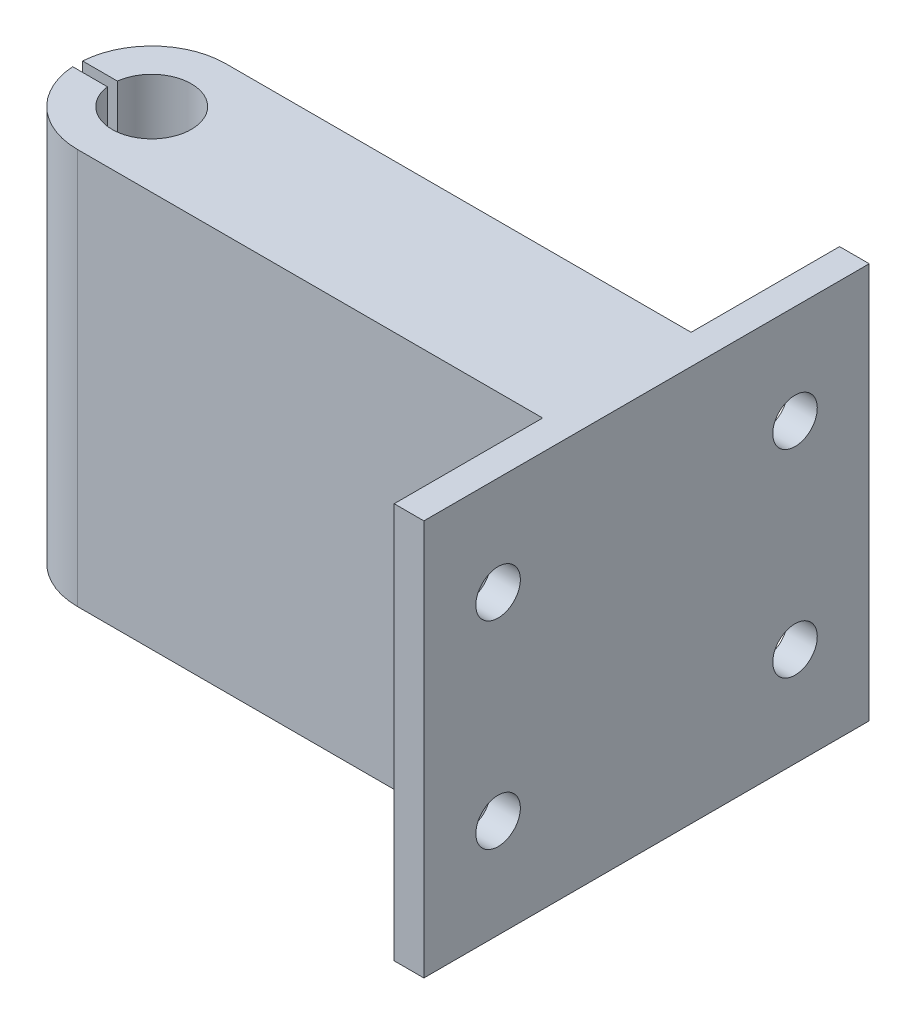
ISO-10303-21;
HEADER;
FILE_DESCRIPTION(('STEP AP214'),'2;1');
FILE_NAME('part.step','',(''),(''),'','','');
FILE_SCHEMA(('AUTOMOTIVE_DESIGN { 1 0 10303 214 1 1 1 1 }'));
ENDSEC;
DATA;
#1=APPLICATION_CONTEXT('core data for automotive mechanical design processes');
#2=APPLICATION_PROTOCOL_DEFINITION('international standard','automotive_design',2000,#1);
#3=PRODUCT_CONTEXT('',#1,'mechanical');
#4=PRODUCT('Part','Part','',(#3));
#5=PRODUCT_RELATED_PRODUCT_CATEGORY('part','',(#4));
#6=PRODUCT_DEFINITION_FORMATION('','',#4);
#7=PRODUCT_DEFINITION_CONTEXT('part definition',#1,'design');
#8=PRODUCT_DEFINITION('design','',#6,#7);
#9=PRODUCT_DEFINITION_SHAPE('','',#8);
#10=(LENGTH_UNIT() NAMED_UNIT(*) SI_UNIT(.MILLI.,.METRE.));
#11=(NAMED_UNIT(*) PLANE_ANGLE_UNIT() SI_UNIT($,.RADIAN.));
#12=(NAMED_UNIT(*) SI_UNIT($,.STERADIAN.) SOLID_ANGLE_UNIT());
#13=UNCERTAINTY_MEASURE_WITH_UNIT(LENGTH_MEASURE(1.E-05),#10,'distance_accuracy_value','');
#14=(GEOMETRIC_REPRESENTATION_CONTEXT(3) GLOBAL_UNCERTAINTY_ASSIGNED_CONTEXT((#13)) GLOBAL_UNIT_ASSIGNED_CONTEXT((#10,
#11,#12)) REPRESENTATION_CONTEXT('',''));
#15=CARTESIAN_POINT('',(0.,0.,0.));
#16=DIRECTION('',(0.,0.,1.));
#17=DIRECTION('',(1.,0.,0.));
#18=AXIS2_PLACEMENT_3D('',#15,#16,#17);
#19=CARTESIAN_POINT('',(0.,0.,0.));
#20=DIRECTION('',(0.,0.,1.));
#21=DIRECTION('',(1.,0.,0.));
#22=AXIS2_PLACEMENT_3D('',#19,#20,#21);
#23=PLANE('',#22);
#24=DIRECTION('',(0.,1.,0.));
#25=VECTOR('',#24,1.);
#26=CARTESIAN_POINT('',(-3.,40.,0.));
#27=LINE('',#26,#25);
#28=CARTESIAN_POINT('',(-3.00000000000001,0.,0.));
#29=VERTEX_POINT('',#28);
#30=CARTESIAN_POINT('',(-3.,40.,0.));
#31=VERTEX_POINT('',#30);
#32=EDGE_CURVE('E238',#29,#31,#27,.T.);
#33=ORIENTED_EDGE('',*,*,#32,.F.);
#34=DIRECTION('',(1.,0.,0.));
#35=VECTOR('',#34,1.);
#36=CARTESIAN_POINT('',(-57.5,0.,0.));
#37=LINE('',#36,#35);
#38=CARTESIAN_POINT('',(-50.,0.,0.));
#39=VERTEX_POINT('',#38);
#40=EDGE_CURVE('E186',#39,#29,#37,.T.);
#41=ORIENTED_EDGE('',*,*,#40,.F.);
#42=DIRECTION('',(0.,-1.,0.));
#43=VECTOR('',#42,1.);
#44=CARTESIAN_POINT('',(-50.,0.,0.));
#45=LINE('',#44,#43);
#46=CARTESIAN_POINT('',(-50.,40.,0.));
#47=VERTEX_POINT('',#46);
#48=EDGE_CURVE('E201',#39,#47,#45,.F.);
#49=ORIENTED_EDGE('',*,*,#48,.T.);
#50=DIRECTION('',(-1.,0.,0.));
#51=VECTOR('',#50,1.);
#52=CARTESIAN_POINT('',(19.,40.,0.));
#53=LINE('',#52,#51);
#54=EDGE_CURVE('E190',#31,#47,#53,.T.);
#55=ORIENTED_EDGE('',*,*,#54,.F.);
#56=EDGE_LOOP('',(#33,#41,#49,#55));
#57=FACE_BOUND('',#56,.T.);
#58=ADVANCED_FACE('F33',(#57),#23,.F.);
#59=CARTESIAN_POINT('',(0.,0.,15.));
#60=DIRECTION('',(0.,0.,1.));
#61=DIRECTION('',(1.,0.,0.));
#62=AXIS2_PLACEMENT_3D('',#59,#60,#61);
#63=PLANE('',#62);
#64=DIRECTION('',(1.,0.,0.));
#65=VECTOR('',#64,1.);
#66=CARTESIAN_POINT('',(-57.5,0.,15.));
#67=LINE('',#66,#65);
#68=CARTESIAN_POINT('',(-50.,0.,15.));
#69=VERTEX_POINT('',#68);
#70=CARTESIAN_POINT('',(-3.,0.,15.));
#71=VERTEX_POINT('',#70);
#72=EDGE_CURVE('E57',#69,#71,#67,.T.);
#73=ORIENTED_EDGE('',*,*,#72,.T.);
#74=DIRECTION('',(0.,-1.,0.));
#75=VECTOR('',#74,1.);
#76=CARTESIAN_POINT('',(-3.,0.,15.));
#77=LINE('',#76,#75);
#78=CARTESIAN_POINT('',(-3.,40.,15.));
#79=VERTEX_POINT('',#78);
#80=EDGE_CURVE('E154',#79,#71,#77,.T.);
#81=ORIENTED_EDGE('',*,*,#80,.F.);
#82=DIRECTION('',(-1.,0.,0.));
#83=VECTOR('',#82,1.);
#84=CARTESIAN_POINT('',(19.,40.,15.));
#85=LINE('',#84,#83);
#86=CARTESIAN_POINT('',(-50.,40.,15.));
#87=VERTEX_POINT('',#86);
#88=EDGE_CURVE('E189',#79,#87,#85,.T.);
#89=ORIENTED_EDGE('',*,*,#88,.T.);
#90=DIRECTION('',(0.,-1.,0.));
#91=VECTOR('',#90,1.);
#92=CARTESIAN_POINT('',(-50.,0.,15.));
#93=LINE('',#92,#91);
#94=EDGE_CURVE('E42',#87,#69,#93,.T.);
#95=ORIENTED_EDGE('',*,*,#94,.T.);
#96=EDGE_LOOP('',(#73,#81,#89,#95));
#97=FACE_BOUND('',#96,.T.);
#98=ADVANCED_FACE('F216',(#97),#63,.T.);
#99=CARTESIAN_POINT('',(-57.5,0.,15.));
#100=DIRECTION('',(0.,1.,0.));
#101=DIRECTION('',(0.,0.,1.));
#102=AXIS2_PLACEMENT_3D('',#99,#100,#101);
#103=PLANE('',#102);
#104=CARTESIAN_POINT('',(-50.,0.,7.5));
#105=DIRECTION('',(0.,1.,0.));
#106=DIRECTION('',(0.,0.,1.));
#107=AXIS2_PLACEMENT_3D('',#104,#105,#106);
#108=CIRCLE('',#107,7.5);
#109=CARTESIAN_POINT('',(-57.5,0.,7.5));
#110=VERTEX_POINT('',#109);
#111=EDGE_CURVE('E197',#69,#110,#108,.F.);
#112=ORIENTED_EDGE('',*,*,#111,.T.);
#113=CARTESIAN_POINT('',(-50.,0.,7.5));
#114=DIRECTION('',(0.,1.,0.));
#115=DIRECTION('',(0.,0.,1.));
#116=AXIS2_PLACEMENT_3D('',#113,#114,#115);
#117=CIRCLE('',#116,7.5);
#118=EDGE_CURVE('E199',#110,#39,#117,.F.);
#119=ORIENTED_EDGE('',*,*,#118,.T.);
#120=ORIENTED_EDGE('',*,*,#40,.T.);
#121=DIRECTION('',(0.,0.,1.));
#122=VECTOR('',#121,1.);
#123=CARTESIAN_POINT('',(-3.00000000000001,0.,-15.));
#124=LINE('',#123,#122);
#125=CARTESIAN_POINT('',(-3.00000000000001,0.,-15.));
#126=VERTEX_POINT('',#125);
#127=EDGE_CURVE('E157',#126,#29,#124,.T.);
#128=ORIENTED_EDGE('',*,*,#127,.F.);
#129=DIRECTION('',(-1.,0.,0.));
#130=VECTOR('',#129,1.);
#131=CARTESIAN_POINT('',(-3.00000000000001,0.,-15.));
#132=LINE('',#131,#130);
#133=CARTESIAN_POINT('',(0.,0.,-15.));
#134=VERTEX_POINT('',#133);
#135=EDGE_CURVE('E242',#134,#126,#132,.T.);
#136=ORIENTED_EDGE('',*,*,#135,.F.);
#137=DIRECTION('',(0.,0.,-1.));
#138=VECTOR('',#137,1.);
#139=CARTESIAN_POINT('',(0.,0.,15.));
#140=LINE('',#139,#138);
#141=CARTESIAN_POINT('',(0.,0.,30.));
#142=VERTEX_POINT('',#141);
#143=EDGE_CURVE('E192',#142,#134,#140,.T.);
#144=ORIENTED_EDGE('',*,*,#143,.F.);
#145=DIRECTION('',(1.,0.,0.));
#146=VECTOR('',#145,1.);
#147=CARTESIAN_POINT('',(0.,0.,30.));
#148=LINE('',#147,#146);
#149=CARTESIAN_POINT('',(-3.,0.,30.));
#150=VERTEX_POINT('',#149);
#151=EDGE_CURVE('E136',#150,#142,#148,.T.);
#152=ORIENTED_EDGE('',*,*,#151,.F.);
#153=DIRECTION('',(0.,0.,-1.));
#154=VECTOR('',#153,1.);
#155=CARTESIAN_POINT('',(-3.,0.,30.));
#156=LINE('',#155,#154);
#157=EDGE_CURVE('E138',#150,#71,#156,.T.);
#158=ORIENTED_EDGE('',*,*,#157,.T.);
#159=ORIENTED_EDGE('',*,*,#72,.F.);
#160=EDGE_LOOP('',(#112,#119,#120,#128,#136,#144,#152,#158,#159));
#161=FACE_BOUND('',#160,.T.);
#162=ADVANCED_FACE('F221',(#161),#103,.F.);
#163=CARTESIAN_POINT('',(0.,0.,15.));
#164=DIRECTION('',(-1.,0.,0.));
#165=DIRECTION('',(0.,0.,1.));
#166=AXIS2_PLACEMENT_3D('',#163,#164,#165);
#167=PLANE('',#166);
#168=CARTESIAN_POINT('',(0.,10.,22.5));
#169=DIRECTION('',(-1.,0.,0.));
#170=DIRECTION('',(0.,0.,1.));
#171=AXIS2_PLACEMENT_3D('',#168,#169,#170);
#172=CIRCLE('',#171,2.25);
#173=CARTESIAN_POINT('',(0.,10.,24.75));
#174=VERTEX_POINT('',#173);
#175=EDGE_CURVE('E269',#174,#174,#172,.F.);
#176=ORIENTED_EDGE('',*,*,#175,.F.);
#177=EDGE_LOOP('',(#176));
#178=FACE_BOUND('',#177,.T.);
#179=CARTESIAN_POINT('',(0.,30.,22.5));
#180=DIRECTION('',(-1.,0.,0.));
#181=DIRECTION('',(0.,0.,1.));
#182=AXIS2_PLACEMENT_3D('',#179,#180,#181);
#183=CIRCLE('',#182,2.25);
#184=CARTESIAN_POINT('',(0.,30.,24.75));
#185=VERTEX_POINT('',#184);
#186=EDGE_CURVE('E263',#185,#185,#183,.F.);
#187=ORIENTED_EDGE('',*,*,#186,.F.);
#188=EDGE_LOOP('',(#187));
#189=FACE_BOUND('',#188,.T.);
#190=CARTESIAN_POINT('',(0.,10.,-7.5));
#191=DIRECTION('',(-1.,0.,0.));
#192=DIRECTION('',(0.,0.,1.));
#193=AXIS2_PLACEMENT_3D('',#190,#191,#192);
#194=CIRCLE('',#193,2.25);
#195=CARTESIAN_POINT('',(0.,10.,-5.24999999999999));
#196=VERTEX_POINT('',#195);
#197=EDGE_CURVE('E257',#196,#196,#194,.T.);
#198=ORIENTED_EDGE('',*,*,#197,.T.);
#199=EDGE_LOOP('',(#198));
#200=FACE_BOUND('',#199,.T.);
#201=CARTESIAN_POINT('',(0.,30.,-7.5));
#202=DIRECTION('',(-1.,0.,0.));
#203=DIRECTION('',(0.,0.,1.));
#204=AXIS2_PLACEMENT_3D('',#201,#202,#203);
#205=CIRCLE('',#204,2.25);
#206=CARTESIAN_POINT('',(0.,30.,-5.25));
#207=VERTEX_POINT('',#206);
#208=EDGE_CURVE('E240',#207,#207,#205,.T.);
#209=ORIENTED_EDGE('',*,*,#208,.T.);
#210=EDGE_LOOP('',(#209));
#211=FACE_BOUND('',#210,.T.);
#212=ORIENTED_EDGE('',*,*,#143,.T.);
#213=DIRECTION('',(0.,-1.,0.));
#214=VECTOR('',#213,1.);
#215=CARTESIAN_POINT('',(0.,0.,-15.));
#216=LINE('',#215,#214);
#217=CARTESIAN_POINT('',(0.,40.,-15.));
#218=VERTEX_POINT('',#217);
#219=EDGE_CURVE('E144',#218,#134,#216,.T.);
#220=ORIENTED_EDGE('',*,*,#219,.F.);
#221=DIRECTION('',(0.,0.,-1.));
#222=VECTOR('',#221,1.);
#223=CARTESIAN_POINT('',(0.,40.,15.));
#224=LINE('',#223,#222);
#225=CARTESIAN_POINT('',(0.,40.,30.));
#226=VERTEX_POINT('',#225);
#227=EDGE_CURVE('E141',#226,#218,#224,.T.);
#228=ORIENTED_EDGE('',*,*,#227,.F.);
#229=DIRECTION('',(0.,1.,0.));
#230=VECTOR('',#229,1.);
#231=CARTESIAN_POINT('',(0.,37.,30.));
#232=LINE('',#231,#230);
#233=EDGE_CURVE('E129',#142,#226,#232,.T.);
#234=ORIENTED_EDGE('',*,*,#233,.F.);
#235=EDGE_LOOP('',(#212,#220,#228,#234));
#236=FACE_BOUND('',#235,.T.);
#237=ADVANCED_FACE('F142',(#178,#189,#200,#211,#236),#167,.F.);
#238=CARTESIAN_POINT('',(19.,40.,15.));
#239=DIRECTION('',(0.,-1.,0.));
#240=DIRECTION('',(1.,0.,0.));
#241=AXIS2_PLACEMENT_3D('',#238,#239,#240);
#242=PLANE('',#241);
#243=DIRECTION('',(-1.,0.,0.));
#244=VECTOR('',#243,1.);
#245=CARTESIAN_POINT('',(-3.,40.,30.));
#246=LINE('',#245,#244);
#247=CARTESIAN_POINT('',(-3.,40.,30.));
#248=VERTEX_POINT('',#247);
#249=EDGE_CURVE('E133',#226,#248,#246,.T.);
#250=ORIENTED_EDGE('',*,*,#249,.F.);
#251=ORIENTED_EDGE('',*,*,#227,.T.);
#252=DIRECTION('',(1.,0.,0.));
#253=VECTOR('',#252,1.);
#254=CARTESIAN_POINT('',(19.,40.,-15.));
#255=LINE('',#254,#253);
#256=CARTESIAN_POINT('',(-3.,40.,-15.));
#257=VERTEX_POINT('',#256);
#258=EDGE_CURVE('E248',#257,#218,#255,.T.);
#259=ORIENTED_EDGE('',*,*,#258,.F.);
#260=DIRECTION('',(0.,0.,1.));
#261=VECTOR('',#260,1.);
#262=CARTESIAN_POINT('',(-3.,40.,-15.));
#263=LINE('',#262,#261);
#264=EDGE_CURVE('E49',#257,#31,#263,.T.);
#265=ORIENTED_EDGE('',*,*,#264,.T.);
#266=ORIENTED_EDGE('',*,*,#54,.T.);
#267=CARTESIAN_POINT('',(-50.,40.,7.5));
#268=DIRECTION('',(0.,-1.,0.));
#269=DIRECTION('',(1.,0.,0.));
#270=AXIS2_PLACEMENT_3D('',#267,#268,#269);
#271=CIRCLE('',#270,7.5);
#272=CARTESIAN_POINT('',(-57.4833147735479,40.,7.));
#273=VERTEX_POINT('',#272);
#274=EDGE_CURVE('E207',#47,#273,#271,.F.);
#275=ORIENTED_EDGE('',*,*,#274,.T.);
#276=DIRECTION('',(-1.,0.,0.));
#277=VECTOR('',#276,1.);
#278=CARTESIAN_POINT('',(-53.9686269665969,40.,7.));
#279=LINE('',#278,#277);
#280=CARTESIAN_POINT('',(-53.9686269665969,40.,7.));
#281=VERTEX_POINT('',#280);
#282=EDGE_CURVE('E179',#281,#273,#279,.T.);
#283=ORIENTED_EDGE('',*,*,#282,.F.);
#284=CARTESIAN_POINT('',(-50.,40.,7.5));
#285=DIRECTION('',(0.,1.,0.));
#286=DIRECTION('',(-1.,0.,0.));
#287=AXIS2_PLACEMENT_3D('',#284,#285,#286);
#288=CIRCLE('',#287,4.);
#289=CARTESIAN_POINT('',(-53.9686269665969,40.,8.));
#290=VERTEX_POINT('',#289);
#291=EDGE_CURVE('E176',#290,#281,#288,.T.);
#292=ORIENTED_EDGE('',*,*,#291,.F.);
#293=DIRECTION('',(1.,0.,0.));
#294=VECTOR('',#293,1.);
#295=CARTESIAN_POINT('',(-57.5,40.,8.));
#296=LINE('',#295,#294);
#297=CARTESIAN_POINT('',(-57.4833147735479,40.,8.));
#298=VERTEX_POINT('',#297);
#299=EDGE_CURVE('E170',#298,#290,#296,.T.);
#300=ORIENTED_EDGE('',*,*,#299,.F.);
#301=CARTESIAN_POINT('',(-50.,40.,7.5));
#302=DIRECTION('',(0.,-1.,0.));
#303=DIRECTION('',(1.,0.,0.));
#304=AXIS2_PLACEMENT_3D('',#301,#302,#303);
#305=CIRCLE('',#304,7.5);
#306=EDGE_CURVE('E204',#298,#87,#305,.F.);
#307=ORIENTED_EDGE('',*,*,#306,.T.);
#308=ORIENTED_EDGE('',*,*,#88,.F.);
#309=DIRECTION('',(0.,0.,-1.));
#310=VECTOR('',#309,1.);
#311=CARTESIAN_POINT('',(-3.,40.,30.));
#312=LINE('',#311,#310);
#313=EDGE_CURVE('E151',#248,#79,#312,.T.);
#314=ORIENTED_EDGE('',*,*,#313,.F.);
#315=EDGE_LOOP('',(#250,#251,#259,#265,#266,#275,#283,#292,#300,#307,#308,#314));
#316=FACE_BOUND('',#315,.T.);
#317=ADVANCED_FACE('F148',(#316),#242,.F.);
#318=CARTESIAN_POINT('',(-50.,20.,7.5));
#319=DIRECTION('',(0.,1.,0.));
#320=DIRECTION('',(-1.,0.,0.));
#321=AXIS2_PLACEMENT_3D('',#318,#319,#320);
#322=CYLINDRICAL_SURFACE('',#321,4.);
#323=ORIENTED_EDGE('',*,*,#291,.T.);
#324=DIRECTION('',(0.,1.,0.));
#325=VECTOR('',#324,1.);
#326=CARTESIAN_POINT('',(-53.9686269665969,20.,7.));
#327=LINE('',#326,#325);
#328=CARTESIAN_POINT('',(-53.9686269665969,20.,7.));
#329=VERTEX_POINT('',#328);
#330=EDGE_CURVE('E175',#329,#281,#327,.T.);
#331=ORIENTED_EDGE('',*,*,#330,.F.);
#332=CARTESIAN_POINT('',(-50.,20.,7.5));
#333=DIRECTION('',(0.,1.,0.));
#334=DIRECTION('',(-1.,0.,0.));
#335=AXIS2_PLACEMENT_3D('',#332,#333,#334);
#336=CIRCLE('',#335,4.);
#337=CARTESIAN_POINT('',(-53.9686269665969,20.,8.));
#338=VERTEX_POINT('',#337);
#339=EDGE_CURVE('E166',#338,#329,#336,.T.);
#340=ORIENTED_EDGE('',*,*,#339,.F.);
#341=DIRECTION('',(0.,1.,0.));
#342=VECTOR('',#341,1.);
#343=CARTESIAN_POINT('',(-53.9686269665969,20.,8.));
#344=LINE('',#343,#342);
#345=EDGE_CURVE('E183',#338,#290,#344,.T.);
#346=ORIENTED_EDGE('',*,*,#345,.T.);
#347=EDGE_LOOP('',(#323,#331,#340,#346));
#348=FACE_BOUND('',#347,.T.);
#349=ADVANCED_FACE('F317',(#348),#322,.F.);
#350=CARTESIAN_POINT('',(-57.5,20.,8.));
#351=DIRECTION('',(0.,0.,1.));
#352=DIRECTION('',(1.,0.,0.));
#353=AXIS2_PLACEMENT_3D('',#350,#351,#352);
#354=PLANE('',#353);
#355=DIRECTION('',(1.,0.,0.));
#356=VECTOR('',#355,1.);
#357=CARTESIAN_POINT('',(-57.5,20.,8.));
#358=LINE('',#357,#356);
#359=CARTESIAN_POINT('',(-57.4833147735479,20.,8.));
#360=VERTEX_POINT('',#359);
#361=EDGE_CURVE('E173',#360,#338,#358,.T.);
#362=ORIENTED_EDGE('',*,*,#361,.F.);
#363=DIRECTION('',(0.,1.,0.));
#364=VECTOR('',#363,1.);
#365=CARTESIAN_POINT('',(-57.4833147735479,20.,8.));
#366=LINE('',#365,#364);
#367=EDGE_CURVE('E11',#360,#298,#366,.T.);
#368=ORIENTED_EDGE('',*,*,#367,.T.);
#369=ORIENTED_EDGE('',*,*,#299,.T.);
#370=ORIENTED_EDGE('',*,*,#345,.F.);
#371=EDGE_LOOP('',(#362,#368,#369,#370));
#372=FACE_BOUND('',#371,.T.);
#373=ADVANCED_FACE('F336',(#372),#354,.F.);
#374=CARTESIAN_POINT('',(-53.9686269665969,20.,7.));
#375=DIRECTION('',(0.,0.,-1.));
#376=DIRECTION('',(-1.,0.,0.));
#377=AXIS2_PLACEMENT_3D('',#374,#375,#376);
#378=PLANE('',#377);
#379=ORIENTED_EDGE('',*,*,#282,.T.);
#380=DIRECTION('',(0.,-1.,0.));
#381=VECTOR('',#380,1.);
#382=CARTESIAN_POINT('',(-57.4833147735479,40.,7.));
#383=LINE('',#382,#381);
#384=CARTESIAN_POINT('',(-57.4833147735479,20.,7.));
#385=VERTEX_POINT('',#384);
#386=EDGE_CURVE('E209',#273,#385,#383,.T.);
#387=ORIENTED_EDGE('',*,*,#386,.T.);
#388=DIRECTION('',(-1.,0.,0.));
#389=VECTOR('',#388,1.);
#390=CARTESIAN_POINT('',(-53.9686269665969,20.,7.));
#391=LINE('',#390,#389);
#392=EDGE_CURVE('E169',#329,#385,#391,.T.);
#393=ORIENTED_EDGE('',*,*,#392,.F.);
#394=ORIENTED_EDGE('',*,*,#330,.T.);
#395=EDGE_LOOP('',(#379,#387,#393,#394));
#396=FACE_BOUND('',#395,.T.);
#397=ADVANCED_FACE('F330',(#396),#378,.F.);
#398=CARTESIAN_POINT('',(-50.,20.,7.5));
#399=DIRECTION('',(0.,1.,0.));
#400=DIRECTION('',(-1.,0.,0.));
#401=AXIS2_PLACEMENT_3D('',#398,#399,#400);
#402=PLANE('',#401);
#403=ORIENTED_EDGE('',*,*,#392,.T.);
#404=CARTESIAN_POINT('',(-50.,20.,7.5));
#405=DIRECTION('',(0.,1.,0.));
#406=DIRECTION('',(-1.,0.,0.));
#407=AXIS2_PLACEMENT_3D('',#404,#405,#406);
#408=CIRCLE('',#407,7.5);
#409=CARTESIAN_POINT('',(-57.5,20.,7.5));
#410=VERTEX_POINT('',#409);
#411=EDGE_CURVE('E213',#385,#410,#408,.T.);
#412=ORIENTED_EDGE('',*,*,#411,.T.);
#413=CARTESIAN_POINT('',(-50.,20.,7.5));
#414=DIRECTION('',(0.,1.,0.));
#415=DIRECTION('',(-1.,0.,0.));
#416=AXIS2_PLACEMENT_3D('',#413,#414,#415);
#417=CIRCLE('',#416,7.5);
#418=EDGE_CURVE('E211',#410,#360,#417,.T.);
#419=ORIENTED_EDGE('',*,*,#418,.T.);
#420=ORIENTED_EDGE('',*,*,#361,.T.);
#421=ORIENTED_EDGE('',*,*,#339,.T.);
#422=EDGE_LOOP('',(#403,#412,#419,#420,#421));
#423=FACE_BOUND('',#422,.T.);
#424=ADVANCED_FACE('F326',(#423),#402,.T.);
#425=CARTESIAN_POINT('',(-50.,0.,7.5));
#426=DIRECTION('',(0.,1.,0.));
#427=DIRECTION('',(-1.,0.,0.));
#428=AXIS2_PLACEMENT_3D('',#425,#426,#427);
#429=CYLINDRICAL_SURFACE('',#428,7.5);
#430=ORIENTED_EDGE('',*,*,#367,.F.);
#431=ORIENTED_EDGE('',*,*,#418,.F.);
#432=DIRECTION('',(0.,-1.,0.));
#433=VECTOR('',#432,1.);
#434=CARTESIAN_POINT('',(-57.5,40.,7.5));
#435=LINE('',#434,#433);
#436=EDGE_CURVE('E37',#110,#410,#435,.F.);
#437=ORIENTED_EDGE('',*,*,#436,.F.);
#438=ORIENTED_EDGE('',*,*,#111,.F.);
#439=ORIENTED_EDGE('',*,*,#94,.F.);
#440=ORIENTED_EDGE('',*,*,#306,.F.);
#441=EDGE_LOOP('',(#430,#431,#437,#438,#439,#440));
#442=FACE_BOUND('',#441,.T.);
#443=ADVANCED_FACE('F35',(#442),#429,.T.);
#444=CARTESIAN_POINT('',(-50.,40.,7.5));
#445=DIRECTION('',(0.,-1.,0.));
#446=DIRECTION('',(1.,0.,0.));
#447=AXIS2_PLACEMENT_3D('',#444,#445,#446);
#448=CYLINDRICAL_SURFACE('',#447,7.5);
#449=ORIENTED_EDGE('',*,*,#274,.F.);
#450=ORIENTED_EDGE('',*,*,#48,.F.);
#451=ORIENTED_EDGE('',*,*,#118,.F.);
#452=ORIENTED_EDGE('',*,*,#436,.T.);
#453=ORIENTED_EDGE('',*,*,#411,.F.);
#454=ORIENTED_EDGE('',*,*,#386,.F.);
#455=EDGE_LOOP('',(#449,#450,#451,#452,#453,#454));
#456=FACE_BOUND('',#455,.T.);
#457=ADVANCED_FACE('F232',(#456),#448,.T.);
#458=CARTESIAN_POINT('',(-3.,0.,30.));
#459=DIRECTION('',(1.,0.,0.));
#460=DIRECTION('',(0.,1.,0.));
#461=AXIS2_PLACEMENT_3D('',#458,#459,#460);
#462=PLANE('',#461);
#463=CARTESIAN_POINT('',(-3.00000000000001,10.,22.5));
#464=DIRECTION('',(1.,0.,0.));
#465=DIRECTION('',(0.,-1.,0.));
#466=AXIS2_PLACEMENT_3D('',#463,#464,#465);
#467=CIRCLE('',#466,2.25);
#468=CARTESIAN_POINT('',(-3.00000000000001,7.75,22.5));
#469=VERTEX_POINT('',#468);
#470=EDGE_CURVE('E146',#469,#469,#467,.T.);
#471=ORIENTED_EDGE('',*,*,#470,.T.);
#472=EDGE_LOOP('',(#471));
#473=FACE_BOUND('',#472,.T.);
#474=CARTESIAN_POINT('',(-3.,30.,22.5));
#475=DIRECTION('',(1.,0.,0.));
#476=DIRECTION('',(0.,-1.,0.));
#477=AXIS2_PLACEMENT_3D('',#474,#475,#476);
#478=CIRCLE('',#477,2.25);
#479=CARTESIAN_POINT('',(-3.,27.75,22.5));
#480=VERTEX_POINT('',#479);
#481=EDGE_CURVE('E266',#480,#480,#478,.T.);
#482=ORIENTED_EDGE('',*,*,#481,.T.);
#483=EDGE_LOOP('',(#482));
#484=FACE_BOUND('',#483,.T.);
#485=ORIENTED_EDGE('',*,*,#80,.T.);
#486=ORIENTED_EDGE('',*,*,#157,.F.);
#487=DIRECTION('',(0.,-1.,0.));
#488=VECTOR('',#487,1.);
#489=CARTESIAN_POINT('',(-3.,0.,30.));
#490=LINE('',#489,#488);
#491=EDGE_CURVE('E153',#248,#150,#490,.T.);
#492=ORIENTED_EDGE('',*,*,#491,.F.);
#493=ORIENTED_EDGE('',*,*,#313,.T.);
#494=EDGE_LOOP('',(#485,#486,#492,#493));
#495=FACE_BOUND('',#494,.T.);
#496=ADVANCED_FACE('F275',(#473,#484,#495),#462,.F.);
#497=CARTESIAN_POINT('',(0.,0.,30.));
#498=DIRECTION('',(0.,0.,-1.));
#499=DIRECTION('',(-1.,0.,0.));
#500=AXIS2_PLACEMENT_3D('',#497,#498,#499);
#501=PLANE('',#500);
#502=ORIENTED_EDGE('',*,*,#233,.T.);
#503=ORIENTED_EDGE('',*,*,#249,.T.);
#504=ORIENTED_EDGE('',*,*,#491,.T.);
#505=ORIENTED_EDGE('',*,*,#151,.T.);
#506=EDGE_LOOP('',(#502,#503,#504,#505));
#507=FACE_BOUND('',#506,.T.);
#508=ADVANCED_FACE('F131',(#507),#501,.F.);
#509=CARTESIAN_POINT('',(-3.,40.,-15.));
#510=DIRECTION('',(1.,0.,0.));
#511=DIRECTION('',(0.,1.,0.));
#512=AXIS2_PLACEMENT_3D('',#509,#510,#511);
#513=PLANE('',#512);
#514=CARTESIAN_POINT('',(-3.00000000000001,10.,-7.5));
#515=DIRECTION('',(-1.,0.,0.));
#516=DIRECTION('',(0.,-1.,0.));
#517=AXIS2_PLACEMENT_3D('',#514,#515,#516);
#518=CIRCLE('',#517,2.25);
#519=CARTESIAN_POINT('',(-3.00000000000001,7.75,-7.5));
#520=VERTEX_POINT('',#519);
#521=EDGE_CURVE('E260',#520,#520,#518,.T.);
#522=ORIENTED_EDGE('',*,*,#521,.F.);
#523=EDGE_LOOP('',(#522));
#524=FACE_BOUND('',#523,.T.);
#525=CARTESIAN_POINT('',(-3.,30.,-7.5));
#526=DIRECTION('',(-1.,0.,0.));
#527=DIRECTION('',(0.,-1.,0.));
#528=AXIS2_PLACEMENT_3D('',#525,#526,#527);
#529=CIRCLE('',#528,2.25);
#530=CARTESIAN_POINT('',(-3.,27.75,-7.5));
#531=VERTEX_POINT('',#530);
#532=EDGE_CURVE('E245',#531,#531,#529,.T.);
#533=ORIENTED_EDGE('',*,*,#532,.F.);
#534=EDGE_LOOP('',(#533));
#535=FACE_BOUND('',#534,.T.);
#536=ORIENTED_EDGE('',*,*,#32,.T.);
#537=ORIENTED_EDGE('',*,*,#264,.F.);
#538=DIRECTION('',(0.,1.,0.));
#539=VECTOR('',#538,1.);
#540=CARTESIAN_POINT('',(-3.,40.,-15.));
#541=LINE('',#540,#539);
#542=EDGE_CURVE('E250',#126,#257,#541,.T.);
#543=ORIENTED_EDGE('',*,*,#542,.F.);
#544=ORIENTED_EDGE('',*,*,#127,.T.);
#545=EDGE_LOOP('',(#536,#537,#543,#544));
#546=FACE_BOUND('',#545,.T.);
#547=ADVANCED_FACE('F306',(#524,#535,#546),#513,.F.);
#548=CARTESIAN_POINT('',(0.,0.,-15.));
#549=DIRECTION('',(0.,0.,1.));
#550=DIRECTION('',(1.,0.,0.));
#551=AXIS2_PLACEMENT_3D('',#548,#549,#550);
#552=PLANE('',#551);
#553=ORIENTED_EDGE('',*,*,#258,.T.);
#554=ORIENTED_EDGE('',*,*,#219,.T.);
#555=ORIENTED_EDGE('',*,*,#135,.T.);
#556=ORIENTED_EDGE('',*,*,#542,.T.);
#557=EDGE_LOOP('',(#553,#554,#555,#556));
#558=FACE_BOUND('',#557,.T.);
#559=ADVANCED_FACE('F297',(#558),#552,.F.);
#560=CARTESIAN_POINT('',(12.,30.,-7.5));
#561=DIRECTION('',(-1.,0.,0.));
#562=DIRECTION('',(0.,-1.,0.));
#563=AXIS2_PLACEMENT_3D('',#560,#561,#562);
#564=CYLINDRICAL_SURFACE('',#563,2.25);
#565=ORIENTED_EDGE('',*,*,#532,.T.);
#566=EDGE_LOOP('',(#565));
#567=FACE_BOUND('',#566,.T.);
#568=ORIENTED_EDGE('',*,*,#208,.F.);
#569=EDGE_LOOP('',(#568));
#570=FACE_BOUND('',#569,.T.);
#571=ADVANCED_FACE('F294',(#567,#570),#564,.F.);
#572=CARTESIAN_POINT('',(12.,10.,-7.5));
#573=DIRECTION('',(-1.,0.,0.));
#574=DIRECTION('',(0.,-1.,0.));
#575=AXIS2_PLACEMENT_3D('',#572,#573,#574);
#576=CYLINDRICAL_SURFACE('',#575,2.25);
#577=ORIENTED_EDGE('',*,*,#521,.T.);
#578=EDGE_LOOP('',(#577));
#579=FACE_BOUND('',#578,.T.);
#580=ORIENTED_EDGE('',*,*,#197,.F.);
#581=EDGE_LOOP('',(#580));
#582=FACE_BOUND('',#581,.T.);
#583=ADVANCED_FACE('F296',(#579,#582),#576,.F.);
#584=CARTESIAN_POINT('',(12.,30.,22.5));
#585=DIRECTION('',(-1.,0.,0.));
#586=DIRECTION('',(0.,-1.,0.));
#587=AXIS2_PLACEMENT_3D('',#584,#585,#586);
#588=CYLINDRICAL_SURFACE('',#587,2.25);
#589=ORIENTED_EDGE('',*,*,#481,.F.);
#590=EDGE_LOOP('',(#589));
#591=FACE_BOUND('',#590,.T.);
#592=ORIENTED_EDGE('',*,*,#186,.T.);
#593=EDGE_LOOP('',(#592));
#594=FACE_BOUND('',#593,.T.);
#595=ADVANCED_FACE('F281',(#591,#594),#588,.F.);
#596=CARTESIAN_POINT('',(12.,10.,22.5));
#597=DIRECTION('',(-1.,0.,0.));
#598=DIRECTION('',(0.,-1.,0.));
#599=AXIS2_PLACEMENT_3D('',#596,#597,#598);
#600=CYLINDRICAL_SURFACE('',#599,2.25);
#601=ORIENTED_EDGE('',*,*,#470,.F.);
#602=EDGE_LOOP('',(#601));
#603=FACE_BOUND('',#602,.T.);
#604=ORIENTED_EDGE('',*,*,#175,.T.);
#605=EDGE_LOOP('',(#604));
#606=FACE_BOUND('',#605,.T.);
#607=ADVANCED_FACE('F278',(#603,#606),#600,.F.);
#608=CLOSED_SHELL('',(#58,#98,#162,#237,#317,#349,#373,#397,#424,#443,#457,#496,#508,#547,#559,
#571,#583,#595,#607));
#609=MANIFOLD_SOLID_BREP('B2',#608);
#610=ADVANCED_BREP_SHAPE_REPRESENTATION('',(#18,#609),#14);
#611=SHAPE_DEFINITION_REPRESENTATION(#9,#610);
ENDSEC;
END-ISO-10303-21;
